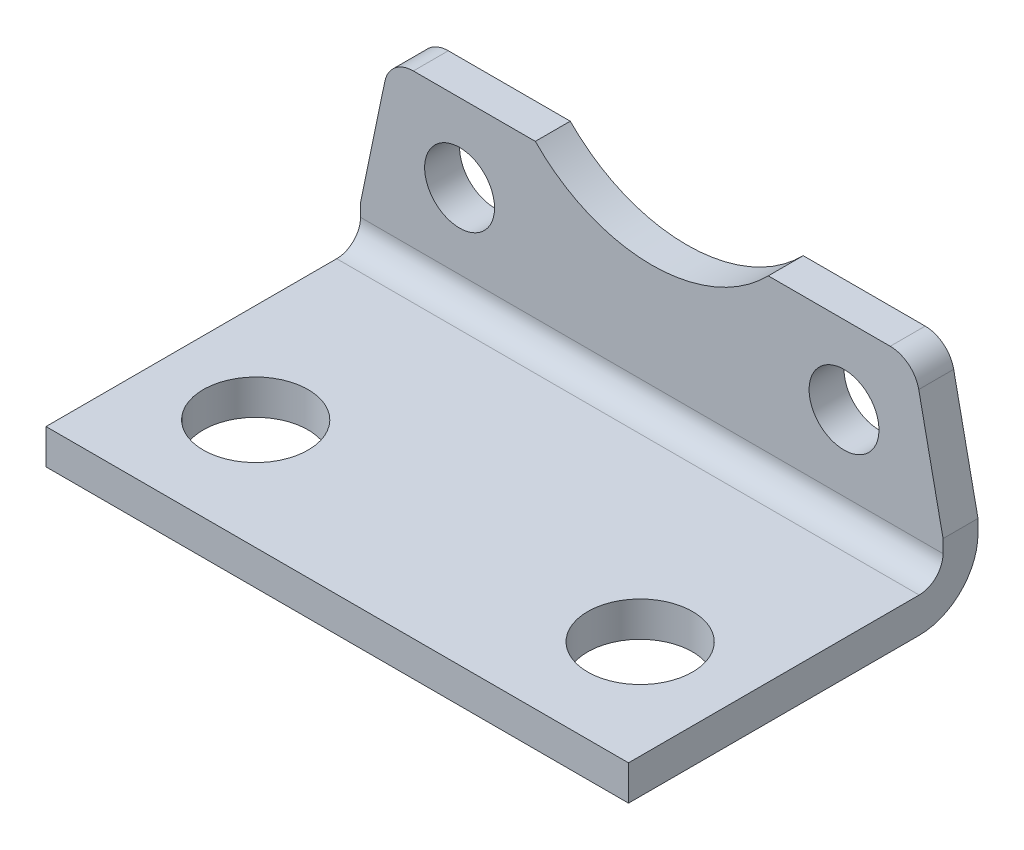
ISO-10303-21;
HEADER;
FILE_DESCRIPTION(('STEP AP214'),'2;1');
FILE_NAME('part.step','',(''),(''),'','','');
FILE_SCHEMA(('AUTOMOTIVE_DESIGN { 1 0 10303 214 1 1 1 1 }'));
ENDSEC;
DATA;
#1=APPLICATION_CONTEXT('core data for automotive mechanical design processes');
#2=APPLICATION_PROTOCOL_DEFINITION('international standard','automotive_design',2000,#1);
#3=PRODUCT_CONTEXT('',#1,'mechanical');
#4=PRODUCT('Part','Part','',(#3));
#5=PRODUCT_RELATED_PRODUCT_CATEGORY('part','',(#4));
#6=PRODUCT_DEFINITION_FORMATION('','',#4);
#7=PRODUCT_DEFINITION_CONTEXT('part definition',#1,'design');
#8=PRODUCT_DEFINITION('design','',#6,#7);
#9=PRODUCT_DEFINITION_SHAPE('','',#8);
#10=(LENGTH_UNIT() NAMED_UNIT(*) SI_UNIT(.MILLI.,.METRE.));
#11=(NAMED_UNIT(*) PLANE_ANGLE_UNIT() SI_UNIT($,.RADIAN.));
#12=(NAMED_UNIT(*) SI_UNIT($,.STERADIAN.) SOLID_ANGLE_UNIT());
#13=UNCERTAINTY_MEASURE_WITH_UNIT(LENGTH_MEASURE(1.E-05),#10,'distance_accuracy_value','');
#14=(GEOMETRIC_REPRESENTATION_CONTEXT(3) GLOBAL_UNCERTAINTY_ASSIGNED_CONTEXT((#13)) GLOBAL_UNIT_ASSIGNED_CONTEXT((#10,
#11,#12)) REPRESENTATION_CONTEXT('',''));
#15=CARTESIAN_POINT('',(0.,0.,0.));
#16=DIRECTION('',(0.,0.,1.));
#17=DIRECTION('',(1.,0.,0.));
#18=AXIS2_PLACEMENT_3D('',#15,#16,#17);
#19=CARTESIAN_POINT('',(-25.,5.05,49.5));
#20=DIRECTION('',(0.,0.,1.));
#21=DIRECTION('',(1.,0.,0.));
#22=AXIS2_PLACEMENT_3D('',#19,#20,#21);
#23=PLANE('',#22);
#24=DIRECTION('',(0.203466721205623,-0.979081862441458,0.));
#25=VECTOR('',#24,1.);
#26=CARTESIAN_POINT('',(22.5,18.2,49.5));
#27=LINE('',#26,#25);
#28=CARTESIAN_POINT('',(22.9138265164144,16.2086668030141,49.5));
#29=VERTEX_POINT('',#28);
#30=CARTESIAN_POINT('',(25.,6.17,49.5));
#31=VERTEX_POINT('',#30);
#32=EDGE_CURVE('E150',#29,#31,#27,.T.);
#33=ORIENTED_EDGE('',*,*,#32,.F.);
#34=CARTESIAN_POINT('',(20.4661218603107,15.7,49.5));
#35=DIRECTION('',(0.,0.,1.));
#36=DIRECTION('',(1.,0.,0.));
#37=AXIS2_PLACEMENT_3D('',#34,#35,#36);
#38=CIRCLE('',#37,2.5);
#39=CARTESIAN_POINT('',(20.4661218603107,18.2,49.5));
#40=VERTEX_POINT('',#39);
#41=EDGE_CURVE('E200',#29,#40,#38,.T.);
#42=ORIENTED_EDGE('',*,*,#41,.T.);
#43=DIRECTION('',(1.,0.,0.));
#44=VECTOR('',#43,1.);
#45=CARTESIAN_POINT('',(-25.,18.2,49.5));
#46=LINE('',#45,#44);
#47=CARTESIAN_POINT('',(9.99799979995999,18.2,49.5));
#48=VERTEX_POINT('',#47);
#49=EDGE_CURVE('E222',#48,#40,#46,.T.);
#50=ORIENTED_EDGE('',*,*,#49,.F.);
#51=CARTESIAN_POINT('',(0.,28.,49.5));
#52=DIRECTION('',(0.,0.,1.));
#53=DIRECTION('',(1.,0.,0.));
#54=AXIS2_PLACEMENT_3D('',#51,#52,#53);
#55=CIRCLE('',#54,14.);
#56=CARTESIAN_POINT('',(-9.99799979995999,18.2,49.5));
#57=VERTEX_POINT('',#56);
#58=EDGE_CURVE('E220',#57,#48,#55,.T.);
#59=ORIENTED_EDGE('',*,*,#58,.F.);
#60=CARTESIAN_POINT('',(-20.4661218603107,18.2,49.5));
#61=VERTEX_POINT('',#60);
#62=EDGE_CURVE('E211',#61,#57,#46,.T.);
#63=ORIENTED_EDGE('',*,*,#62,.F.);
#64=CARTESIAN_POINT('',(-20.4661218603107,15.7,49.5));
#65=DIRECTION('',(0.,0.,1.));
#66=DIRECTION('',(1.,0.,0.));
#67=AXIS2_PLACEMENT_3D('',#64,#65,#66);
#68=CIRCLE('',#67,2.5);
#69=CARTESIAN_POINT('',(-22.9138265164144,16.2086668030141,49.5));
#70=VERTEX_POINT('',#69);
#71=EDGE_CURVE('E198',#61,#70,#68,.T.);
#72=ORIENTED_EDGE('',*,*,#71,.T.);
#73=DIRECTION('',(0.203466721205623,0.979081862441458,0.));
#74=VECTOR('',#73,1.);
#75=CARTESIAN_POINT('',(-22.5,18.2,49.5));
#76=LINE('',#75,#74);
#77=CARTESIAN_POINT('',(-25.,6.17,49.5));
#78=VERTEX_POINT('',#77);
#79=EDGE_CURVE('E290',#78,#70,#76,.T.);
#80=ORIENTED_EDGE('',*,*,#79,.F.);
#81=DIRECTION('',(0.,-1.,0.));
#82=VECTOR('',#81,1.);
#83=CARTESIAN_POINT('',(-25.,5.05,49.5));
#84=LINE('',#83,#82);
#85=CARTESIAN_POINT('',(-25.,5.05,49.5));
#86=VERTEX_POINT('',#85);
#87=EDGE_CURVE('E263',#78,#86,#84,.T.);
#88=ORIENTED_EDGE('',*,*,#87,.T.);
#89=DIRECTION('',(1.,0.,0.));
#90=VECTOR('',#89,1.);
#91=CARTESIAN_POINT('',(-25.,5.05,49.5));
#92=LINE('',#91,#90);
#93=CARTESIAN_POINT('',(25.,5.05,49.5));
#94=VERTEX_POINT('',#93);
#95=EDGE_CURVE('E183',#86,#94,#92,.T.);
#96=ORIENTED_EDGE('',*,*,#95,.T.);
#97=DIRECTION('',(0.,-1.,0.));
#98=VECTOR('',#97,1.);
#99=CARTESIAN_POINT('',(25.,5.05,49.5));
#100=LINE('',#99,#98);
#101=EDGE_CURVE('E159',#31,#94,#100,.T.);
#102=ORIENTED_EDGE('',*,*,#101,.F.);
#103=EDGE_LOOP('',(#33,#42,#50,#59,#63,#72,#80,#88,#96,#102));
#104=FACE_BOUND('',#103,.T.);
#105=CARTESIAN_POINT('',(-16.5,11.5,49.5));
#106=DIRECTION('',(0.,0.,1.));
#107=DIRECTION('',(1.,0.,0.));
#108=AXIS2_PLACEMENT_3D('',#105,#106,#107);
#109=CIRCLE('',#108,3.);
#110=CARTESIAN_POINT('',(-13.5,11.5,49.5));
#111=VERTEX_POINT('',#110);
#112=EDGE_CURVE('E235',#111,#111,#109,.T.);
#113=ORIENTED_EDGE('',*,*,#112,.F.);
#114=EDGE_LOOP('',(#113));
#115=FACE_BOUND('',#114,.T.);
#116=CARTESIAN_POINT('',(16.5,11.5,49.5));
#117=DIRECTION('',(0.,0.,-1.));
#118=DIRECTION('',(-1.,0.,0.));
#119=AXIS2_PLACEMENT_3D('',#116,#117,#118);
#120=CIRCLE('',#119,3.);
#121=CARTESIAN_POINT('',(13.5,11.5,49.5));
#122=VERTEX_POINT('',#121);
#123=EDGE_CURVE('E230',#122,#122,#120,.T.);
#124=ORIENTED_EDGE('',*,*,#123,.T.);
#125=EDGE_LOOP('',(#124));
#126=FACE_BOUND('',#125,.T.);
#127=ADVANCED_FACE('F32',(#104,#115,#126),#23,.T.);
#128=CARTESIAN_POINT('',(-25.,5.05,46.5));
#129=DIRECTION('',(0.,0.,-1.));
#130=DIRECTION('',(0.,1.,0.));
#131=AXIS2_PLACEMENT_3D('',#128,#129,#130);
#132=PLANE('',#131);
#133=DIRECTION('',(1.,0.,0.));
#134=VECTOR('',#133,1.);
#135=CARTESIAN_POINT('',(-25.,18.2,46.5));
#136=LINE('',#135,#134);
#137=CARTESIAN_POINT('',(9.99799979995999,18.2,46.5));
#138=VERTEX_POINT('',#137);
#139=CARTESIAN_POINT('',(20.4661218603107,18.2,46.5));
#140=VERTEX_POINT('',#139);
#141=EDGE_CURVE('E221',#138,#140,#136,.T.);
#142=ORIENTED_EDGE('',*,*,#141,.T.);
#143=CARTESIAN_POINT('',(20.4661218603107,15.7,46.5));
#144=DIRECTION('',(0.,0.,-1.));
#145=DIRECTION('',(0.,1.,0.));
#146=AXIS2_PLACEMENT_3D('',#143,#144,#145);
#147=CIRCLE('',#146,2.5);
#148=CARTESIAN_POINT('',(22.9138265164144,16.2086668030141,46.5));
#149=VERTEX_POINT('',#148);
#150=EDGE_CURVE('E140',#140,#149,#147,.T.);
#151=ORIENTED_EDGE('',*,*,#150,.T.);
#152=DIRECTION('',(0.203466721205623,-0.979081862441458,0.));
#153=VECTOR('',#152,1.);
#154=CARTESIAN_POINT('',(22.5,18.2,46.5));
#155=LINE('',#154,#153);
#156=CARTESIAN_POINT('',(25.,6.17,46.5));
#157=VERTEX_POINT('',#156);
#158=EDGE_CURVE('E131',#149,#157,#155,.T.);
#159=ORIENTED_EDGE('',*,*,#158,.T.);
#160=DIRECTION('',(0.,1.,0.));
#161=VECTOR('',#160,1.);
#162=CARTESIAN_POINT('',(25.,5.05,46.5));
#163=LINE('',#162,#161);
#164=CARTESIAN_POINT('',(25.,5.05,46.5));
#165=VERTEX_POINT('',#164);
#166=EDGE_CURVE('E137',#165,#157,#163,.T.);
#167=ORIENTED_EDGE('',*,*,#166,.F.);
#168=DIRECTION('',(1.,0.,0.));
#169=VECTOR('',#168,1.);
#170=CARTESIAN_POINT('',(-25.,5.05,46.5));
#171=LINE('',#170,#169);
#172=CARTESIAN_POINT('',(-25.,5.05,46.5));
#173=VERTEX_POINT('',#172);
#174=EDGE_CURVE('E186',#173,#165,#171,.T.);
#175=ORIENTED_EDGE('',*,*,#174,.F.);
#176=DIRECTION('',(0.,1.,0.));
#177=VECTOR('',#176,1.);
#178=CARTESIAN_POINT('',(-25.,5.05,46.5));
#179=LINE('',#178,#177);
#180=CARTESIAN_POINT('',(-25.,6.17,46.5));
#181=VERTEX_POINT('',#180);
#182=EDGE_CURVE('E260',#173,#181,#179,.T.);
#183=ORIENTED_EDGE('',*,*,#182,.T.);
#184=DIRECTION('',(0.203466721205623,0.979081862441458,0.));
#185=VECTOR('',#184,1.);
#186=CARTESIAN_POINT('',(-22.5,18.2,46.5));
#187=LINE('',#186,#185);
#188=CARTESIAN_POINT('',(-22.9138265164144,16.2086668030141,46.5));
#189=VERTEX_POINT('',#188);
#190=EDGE_CURVE('E145',#181,#189,#187,.T.);
#191=ORIENTED_EDGE('',*,*,#190,.T.);
#192=CARTESIAN_POINT('',(-20.4661218603107,15.7,46.5));
#193=DIRECTION('',(0.,0.,-1.));
#194=DIRECTION('',(0.,1.,0.));
#195=AXIS2_PLACEMENT_3D('',#192,#193,#194);
#196=CIRCLE('',#195,2.5);
#197=CARTESIAN_POINT('',(-20.4661218603107,18.2,46.5));
#198=VERTEX_POINT('',#197);
#199=EDGE_CURVE('E47',#189,#198,#196,.T.);
#200=ORIENTED_EDGE('',*,*,#199,.T.);
#201=CARTESIAN_POINT('',(-9.99799979995999,18.2,46.5));
#202=VERTEX_POINT('',#201);
#203=EDGE_CURVE('E212',#198,#202,#136,.T.);
#204=ORIENTED_EDGE('',*,*,#203,.T.);
#205=CARTESIAN_POINT('',(0.,28.,46.5));
#206=DIRECTION('',(0.,0.,1.));
#207=DIRECTION('',(1.,0.,0.));
#208=AXIS2_PLACEMENT_3D('',#205,#206,#207);
#209=CIRCLE('',#208,14.);
#210=EDGE_CURVE('E227',#202,#138,#209,.T.);
#211=ORIENTED_EDGE('',*,*,#210,.T.);
#212=EDGE_LOOP('',(#142,#151,#159,#167,#175,#183,#191,#200,#204,#211));
#213=FACE_BOUND('',#212,.T.);
#214=CARTESIAN_POINT('',(-16.5,11.5,46.5));
#215=DIRECTION('',(0.,0.,1.));
#216=DIRECTION('',(1.,0.,0.));
#217=AXIS2_PLACEMENT_3D('',#214,#215,#216);
#218=CIRCLE('',#217,3.);
#219=CARTESIAN_POINT('',(-13.5,11.5,46.5));
#220=VERTEX_POINT('',#219);
#221=EDGE_CURVE('E238',#220,#220,#218,.T.);
#222=ORIENTED_EDGE('',*,*,#221,.T.);
#223=EDGE_LOOP('',(#222));
#224=FACE_BOUND('',#223,.T.);
#225=CARTESIAN_POINT('',(16.5,11.5,46.5));
#226=DIRECTION('',(0.,0.,-1.));
#227=DIRECTION('',(-1.,0.,0.));
#228=AXIS2_PLACEMENT_3D('',#225,#226,#227);
#229=CIRCLE('',#228,3.);
#230=CARTESIAN_POINT('',(13.5,11.5,46.5));
#231=VERTEX_POINT('',#230);
#232=EDGE_CURVE('E232',#231,#231,#229,.T.);
#233=ORIENTED_EDGE('',*,*,#232,.F.);
#234=EDGE_LOOP('',(#233));
#235=FACE_BOUND('',#234,.T.);
#236=ADVANCED_FACE('F134',(#213,#224,#235),#132,.T.);
#237=CARTESIAN_POINT('',(-25.,0.,76.5));
#238=DIRECTION('',(0.,-1.,0.));
#239=DIRECTION('',(0.,0.,-1.));
#240=AXIS2_PLACEMENT_3D('',#237,#238,#239);
#241=PLANE('',#240);
#242=DIRECTION('',(0.,0.,-1.));
#243=VECTOR('',#242,1.);
#244=CARTESIAN_POINT('',(25.,0.,76.5));
#245=LINE('',#244,#243);
#246=CARTESIAN_POINT('',(25.,0.,76.5));
#247=VERTEX_POINT('',#246);
#248=CARTESIAN_POINT('',(25.,0.,51.55));
#249=VERTEX_POINT('',#248);
#250=EDGE_CURVE('E163',#247,#249,#245,.T.);
#251=ORIENTED_EDGE('',*,*,#250,.F.);
#252=DIRECTION('',(1.,0.,0.));
#253=VECTOR('',#252,1.);
#254=CARTESIAN_POINT('',(-25.,0.,76.5));
#255=LINE('',#254,#253);
#256=CARTESIAN_POINT('',(-25.,0.,76.5));
#257=VERTEX_POINT('',#256);
#258=EDGE_CURVE('E176',#257,#247,#255,.T.);
#259=ORIENTED_EDGE('',*,*,#258,.F.);
#260=DIRECTION('',(0.,0.,-1.));
#261=VECTOR('',#260,1.);
#262=CARTESIAN_POINT('',(-25.,0.,76.5));
#263=LINE('',#262,#261);
#264=CARTESIAN_POINT('',(-25.,0.,51.55));
#265=VERTEX_POINT('',#264);
#266=EDGE_CURVE('E175',#257,#265,#263,.T.);
#267=ORIENTED_EDGE('',*,*,#266,.T.);
#268=DIRECTION('',(1.,0.,0.));
#269=VECTOR('',#268,1.);
#270=CARTESIAN_POINT('',(-25.,0.,51.55));
#271=LINE('',#270,#269);
#272=EDGE_CURVE('E188',#265,#249,#271,.T.);
#273=ORIENTED_EDGE('',*,*,#272,.T.);
#274=EDGE_LOOP('',(#251,#259,#267,#273));
#275=FACE_BOUND('',#274,.T.);
#276=CARTESIAN_POINT('',(-16.5,0.,67.));
#277=DIRECTION('',(0.,1.,0.));
#278=DIRECTION('',(0.,0.,1.));
#279=AXIS2_PLACEMENT_3D('',#276,#277,#278);
#280=CIRCLE('',#279,4.50000000000001);
#281=CARTESIAN_POINT('',(-16.5,0.,71.5));
#282=VERTEX_POINT('',#281);
#283=EDGE_CURVE('E250',#282,#282,#280,.T.);
#284=ORIENTED_EDGE('',*,*,#283,.T.);
#285=EDGE_LOOP('',(#284));
#286=FACE_BOUND('',#285,.T.);
#287=CARTESIAN_POINT('',(16.5,0.,67.));
#288=DIRECTION('',(0.,-1.,0.));
#289=DIRECTION('',(0.,0.,1.));
#290=AXIS2_PLACEMENT_3D('',#287,#288,#289);
#291=CIRCLE('',#290,4.50000000000001);
#292=CARTESIAN_POINT('',(16.5,0.,71.5));
#293=VERTEX_POINT('',#292);
#294=EDGE_CURVE('E244',#293,#293,#291,.T.);
#295=ORIENTED_EDGE('',*,*,#294,.F.);
#296=EDGE_LOOP('',(#295));
#297=FACE_BOUND('',#296,.T.);
#298=ADVANCED_FACE('F275',(#275,#286,#297),#241,.T.);
#299=CARTESIAN_POINT('',(-25.,3.,76.5));
#300=DIRECTION('',(0.,1.,0.));
#301=DIRECTION('',(0.,0.,1.));
#302=AXIS2_PLACEMENT_3D('',#299,#300,#301);
#303=PLANE('',#302);
#304=DIRECTION('',(0.,0.,1.));
#305=VECTOR('',#304,1.);
#306=CARTESIAN_POINT('',(25.,3.,76.5));
#307=LINE('',#306,#305);
#308=CARTESIAN_POINT('',(25.,3.,51.55));
#309=VERTEX_POINT('',#308);
#310=CARTESIAN_POINT('',(25.,3.,76.5));
#311=VERTEX_POINT('',#310);
#312=EDGE_CURVE('E169',#309,#311,#307,.T.);
#313=ORIENTED_EDGE('',*,*,#312,.F.);
#314=DIRECTION('',(1.,0.,0.));
#315=VECTOR('',#314,1.);
#316=CARTESIAN_POINT('',(-25.,3.,51.55));
#317=LINE('',#316,#315);
#318=CARTESIAN_POINT('',(-25.,3.,51.55));
#319=VERTEX_POINT('',#318);
#320=EDGE_CURVE('E181',#319,#309,#317,.T.);
#321=ORIENTED_EDGE('',*,*,#320,.F.);
#322=DIRECTION('',(0.,0.,1.));
#323=VECTOR('',#322,1.);
#324=CARTESIAN_POINT('',(-25.,3.,76.5));
#325=LINE('',#324,#323);
#326=CARTESIAN_POINT('',(-25.,3.,76.5));
#327=VERTEX_POINT('',#326);
#328=EDGE_CURVE('E268',#319,#327,#325,.T.);
#329=ORIENTED_EDGE('',*,*,#328,.T.);
#330=DIRECTION('',(1.,0.,0.));
#331=VECTOR('',#330,1.);
#332=CARTESIAN_POINT('',(-25.,3.,76.5));
#333=LINE('',#332,#331);
#334=EDGE_CURVE('E179',#327,#311,#333,.T.);
#335=ORIENTED_EDGE('',*,*,#334,.T.);
#336=EDGE_LOOP('',(#313,#321,#329,#335));
#337=FACE_BOUND('',#336,.T.);
#338=CARTESIAN_POINT('',(-16.5,3.,67.));
#339=DIRECTION('',(0.,1.,0.));
#340=DIRECTION('',(0.,0.,1.));
#341=AXIS2_PLACEMENT_3D('',#338,#339,#340);
#342=CIRCLE('',#341,4.50000000000001);
#343=CARTESIAN_POINT('',(-16.5,3.,71.5));
#344=VERTEX_POINT('',#343);
#345=EDGE_CURVE('E247',#344,#344,#342,.T.);
#346=ORIENTED_EDGE('',*,*,#345,.F.);
#347=EDGE_LOOP('',(#346));
#348=FACE_BOUND('',#347,.T.);
#349=CARTESIAN_POINT('',(16.5,3.,67.));
#350=DIRECTION('',(0.,-1.,0.));
#351=DIRECTION('',(0.,0.,1.));
#352=AXIS2_PLACEMENT_3D('',#349,#350,#351);
#353=CIRCLE('',#352,4.50000000000001);
#354=CARTESIAN_POINT('',(16.5,3.,71.5));
#355=VERTEX_POINT('',#354);
#356=EDGE_CURVE('E241',#355,#355,#353,.T.);
#357=ORIENTED_EDGE('',*,*,#356,.T.);
#358=EDGE_LOOP('',(#357));
#359=FACE_BOUND('',#358,.T.);
#360=ADVANCED_FACE('F312',(#337,#348,#359),#303,.T.);
#361=CARTESIAN_POINT('',(-25.,0.,76.5));
#362=DIRECTION('',(0.,0.,1.));
#363=DIRECTION('',(1.,0.,0.));
#364=AXIS2_PLACEMENT_3D('',#361,#362,#363);
#365=PLANE('',#364);
#366=DIRECTION('',(0.,-1.,0.));
#367=VECTOR('',#366,1.);
#368=CARTESIAN_POINT('',(25.,0.,76.5));
#369=LINE('',#368,#367);
#370=EDGE_CURVE('E172',#311,#247,#369,.T.);
#371=ORIENTED_EDGE('',*,*,#370,.F.);
#372=ORIENTED_EDGE('',*,*,#334,.F.);
#373=DIRECTION('',(0.,-1.,0.));
#374=VECTOR('',#373,1.);
#375=CARTESIAN_POINT('',(-25.,0.,76.5));
#376=LINE('',#375,#374);
#377=EDGE_CURVE('E190',#327,#257,#376,.T.);
#378=ORIENTED_EDGE('',*,*,#377,.T.);
#379=ORIENTED_EDGE('',*,*,#258,.T.);
#380=EDGE_LOOP('',(#371,#372,#378,#379));
#381=FACE_BOUND('',#380,.T.);
#382=ADVANCED_FACE('F316',(#381),#365,.T.);
#383=CARTESIAN_POINT('',(-25.,5.05,51.55));
#384=DIRECTION('',(1.,0.,0.));
#385=DIRECTION('',(0.,0.,-1.));
#386=AXIS2_PLACEMENT_3D('',#383,#384,#385);
#387=CYLINDRICAL_SURFACE('',#386,2.05);
#388=CARTESIAN_POINT('',(25.,5.05,51.55));
#389=DIRECTION('',(-1.,0.,0.));
#390=DIRECTION('',(0.,0.,-1.));
#391=AXIS2_PLACEMENT_3D('',#388,#389,#390);
#392=CIRCLE('',#391,2.05);
#393=EDGE_CURVE('E161',#94,#309,#392,.T.);
#394=ORIENTED_EDGE('',*,*,#393,.F.);
#395=ORIENTED_EDGE('',*,*,#95,.F.);
#396=CARTESIAN_POINT('',(-25.,5.05,51.55));
#397=DIRECTION('',(-1.,0.,0.));
#398=DIRECTION('',(0.,0.,-1.));
#399=AXIS2_PLACEMENT_3D('',#396,#397,#398);
#400=CIRCLE('',#399,2.05);
#401=EDGE_CURVE('E265',#86,#319,#400,.T.);
#402=ORIENTED_EDGE('',*,*,#401,.T.);
#403=ORIENTED_EDGE('',*,*,#320,.T.);
#404=EDGE_LOOP('',(#394,#395,#402,#403));
#405=FACE_BOUND('',#404,.T.);
#406=ADVANCED_FACE('F306',(#405),#387,.F.);
#407=CARTESIAN_POINT('',(-25.,5.05,51.55));
#408=DIRECTION('',(1.,0.,0.));
#409=DIRECTION('',(0.,0.,-1.));
#410=AXIS2_PLACEMENT_3D('',#407,#408,#409);
#411=CYLINDRICAL_SURFACE('',#410,5.05000000000001);
#412=CARTESIAN_POINT('',(25.,5.05,51.55));
#413=DIRECTION('',(1.,0.,0.));
#414=DIRECTION('',(0.,0.,-1.));
#415=AXIS2_PLACEMENT_3D('',#412,#413,#414);
#416=CIRCLE('',#415,5.05000000000001);
#417=EDGE_CURVE('E158',#249,#165,#416,.T.);
#418=ORIENTED_EDGE('',*,*,#417,.F.);
#419=ORIENTED_EDGE('',*,*,#272,.F.);
#420=CARTESIAN_POINT('',(-25.,5.05,51.55));
#421=DIRECTION('',(1.,0.,0.));
#422=DIRECTION('',(0.,0.,-1.));
#423=AXIS2_PLACEMENT_3D('',#420,#421,#422);
#424=CIRCLE('',#423,5.05000000000001);
#425=EDGE_CURVE('E257',#265,#173,#424,.T.);
#426=ORIENTED_EDGE('',*,*,#425,.T.);
#427=ORIENTED_EDGE('',*,*,#174,.T.);
#428=EDGE_LOOP('',(#418,#419,#426,#427));
#429=FACE_BOUND('',#428,.T.);
#430=ADVANCED_FACE('F280',(#429),#411,.T.);
#431=CARTESIAN_POINT('',(-25.,5.05,51.55));
#432=DIRECTION('',(1.,0.,0.));
#433=DIRECTION('',(0.,0.,-1.));
#434=AXIS2_PLACEMENT_3D('',#431,#432,#433);
#435=PLANE('',#434);
#436=ORIENTED_EDGE('',*,*,#87,.F.);
#437=DIRECTION('',(0.,0.,1.));
#438=VECTOR('',#437,1.);
#439=CARTESIAN_POINT('',(-25.,6.17,46.5));
#440=LINE('',#439,#438);
#441=EDGE_CURVE('E153',#181,#78,#440,.T.);
#442=ORIENTED_EDGE('',*,*,#441,.F.);
#443=ORIENTED_EDGE('',*,*,#182,.F.);
#444=ORIENTED_EDGE('',*,*,#425,.F.);
#445=ORIENTED_EDGE('',*,*,#266,.F.);
#446=ORIENTED_EDGE('',*,*,#377,.F.);
#447=ORIENTED_EDGE('',*,*,#328,.F.);
#448=ORIENTED_EDGE('',*,*,#401,.F.);
#449=EDGE_LOOP('',(#436,#442,#443,#444,#445,#446,#447,#448));
#450=FACE_BOUND('',#449,.T.);
#451=ADVANCED_FACE('F285',(#450),#435,.F.);
#452=CARTESIAN_POINT('',(25.,5.05,51.55));
#453=DIRECTION('',(1.,0.,0.));
#454=DIRECTION('',(0.,0.,-1.));
#455=AXIS2_PLACEMENT_3D('',#452,#453,#454);
#456=PLANE('',#455);
#457=DIRECTION('',(0.,0.,1.));
#458=VECTOR('',#457,1.);
#459=CARTESIAN_POINT('',(25.,6.17,46.5));
#460=LINE('',#459,#458);
#461=EDGE_CURVE('E144',#157,#31,#460,.T.);
#462=ORIENTED_EDGE('',*,*,#461,.T.);
#463=ORIENTED_EDGE('',*,*,#101,.T.);
#464=ORIENTED_EDGE('',*,*,#393,.T.);
#465=ORIENTED_EDGE('',*,*,#312,.T.);
#466=ORIENTED_EDGE('',*,*,#370,.T.);
#467=ORIENTED_EDGE('',*,*,#250,.T.);
#468=ORIENTED_EDGE('',*,*,#417,.T.);
#469=ORIENTED_EDGE('',*,*,#166,.T.);
#470=EDGE_LOOP('',(#462,#463,#464,#465,#466,#467,#468,#469));
#471=FACE_BOUND('',#470,.T.);
#472=ADVANCED_FACE('F155',(#471),#456,.T.);
#473=CARTESIAN_POINT('',(-16.5,0.,67.));
#474=DIRECTION('',(0.,1.,0.));
#475=DIRECTION('',(0.,0.,1.));
#476=AXIS2_PLACEMENT_3D('',#473,#474,#475);
#477=CYLINDRICAL_SURFACE('',#476,4.50000000000001);
#478=ORIENTED_EDGE('',*,*,#283,.F.);
#479=EDGE_LOOP('',(#478));
#480=FACE_BOUND('',#479,.T.);
#481=ORIENTED_EDGE('',*,*,#345,.T.);
#482=EDGE_LOOP('',(#481));
#483=FACE_BOUND('',#482,.T.);
#484=ADVANCED_FACE('F328',(#480,#483),#477,.F.);
#485=CARTESIAN_POINT('',(16.5,0.,67.));
#486=DIRECTION('',(0.,1.,0.));
#487=DIRECTION('',(0.,0.,1.));
#488=AXIS2_PLACEMENT_3D('',#485,#486,#487);
#489=CYLINDRICAL_SURFACE('',#488,4.50000000000001);
#490=ORIENTED_EDGE('',*,*,#294,.T.);
#491=EDGE_LOOP('',(#490));
#492=FACE_BOUND('',#491,.T.);
#493=ORIENTED_EDGE('',*,*,#356,.F.);
#494=EDGE_LOOP('',(#493));
#495=FACE_BOUND('',#494,.T.);
#496=ADVANCED_FACE('F333',(#492,#495),#489,.F.);
#497=CARTESIAN_POINT('',(-16.5,11.5,46.5));
#498=DIRECTION('',(0.,0.,1.));
#499=DIRECTION('',(1.,0.,0.));
#500=AXIS2_PLACEMENT_3D('',#497,#498,#499);
#501=CYLINDRICAL_SURFACE('',#500,3.);
#502=ORIENTED_EDGE('',*,*,#221,.F.);
#503=EDGE_LOOP('',(#502));
#504=FACE_BOUND('',#503,.T.);
#505=ORIENTED_EDGE('',*,*,#112,.T.);
#506=EDGE_LOOP('',(#505));
#507=FACE_BOUND('',#506,.T.);
#508=ADVANCED_FACE('F337',(#504,#507),#501,.F.);
#509=CARTESIAN_POINT('',(16.5,11.5,46.5));
#510=DIRECTION('',(0.,0.,1.));
#511=DIRECTION('',(1.,0.,0.));
#512=AXIS2_PLACEMENT_3D('',#509,#510,#511);
#513=CYLINDRICAL_SURFACE('',#512,3.);
#514=ORIENTED_EDGE('',*,*,#232,.T.);
#515=EDGE_LOOP('',(#514));
#516=FACE_BOUND('',#515,.T.);
#517=ORIENTED_EDGE('',*,*,#123,.F.);
#518=EDGE_LOOP('',(#517));
#519=FACE_BOUND('',#518,.T.);
#520=ADVANCED_FACE('F341',(#516,#519),#513,.F.);
#521=CARTESIAN_POINT('',(0.,28.,46.5));
#522=DIRECTION('',(0.,0.,1.));
#523=DIRECTION('',(1.,0.,0.));
#524=AXIS2_PLACEMENT_3D('',#521,#522,#523);
#525=CYLINDRICAL_SURFACE('',#524,14.);
#526=ORIENTED_EDGE('',*,*,#58,.T.);
#527=DIRECTION('',(0.,0.,1.));
#528=VECTOR('',#527,1.);
#529=CARTESIAN_POINT('',(9.99799979995999,18.2,46.5));
#530=LINE('',#529,#528);
#531=EDGE_CURVE('E193',#48,#138,#530,.F.);
#532=ORIENTED_EDGE('',*,*,#531,.T.);
#533=ORIENTED_EDGE('',*,*,#210,.F.);
#534=DIRECTION('',(0.,0.,1.));
#535=VECTOR('',#534,1.);
#536=CARTESIAN_POINT('',(-9.99799979995999,18.2,46.5));
#537=LINE('',#536,#535);
#538=EDGE_CURVE('E178',#202,#57,#537,.T.);
#539=ORIENTED_EDGE('',*,*,#538,.T.);
#540=EDGE_LOOP('',(#526,#532,#533,#539));
#541=FACE_BOUND('',#540,.T.);
#542=ADVANCED_FACE('F345',(#541),#525,.F.);
#543=CARTESIAN_POINT('',(-25.,18.2,46.5));
#544=DIRECTION('',(0.,-1.,0.));
#545=DIRECTION('',(0.,0.,-1.));
#546=AXIS2_PLACEMENT_3D('',#543,#544,#545);
#547=PLANE('',#546);
#548=ORIENTED_EDGE('',*,*,#203,.F.);
#549=DIRECTION('',(0.,0.,1.));
#550=VECTOR('',#549,1.);
#551=CARTESIAN_POINT('',(-20.4661218603107,18.2,46.5));
#552=LINE('',#551,#550);
#553=EDGE_CURVE('E40',#198,#61,#552,.T.);
#554=ORIENTED_EDGE('',*,*,#553,.T.);
#555=ORIENTED_EDGE('',*,*,#62,.T.);
#556=ORIENTED_EDGE('',*,*,#538,.F.);
#557=EDGE_LOOP('',(#548,#554,#555,#556));
#558=FACE_BOUND('',#557,.T.);
#559=ADVANCED_FACE('F209',(#558),#547,.F.);
#560=ORIENTED_EDGE('',*,*,#49,.T.);
#561=DIRECTION('',(0.,0.,1.));
#562=VECTOR('',#561,1.);
#563=CARTESIAN_POINT('',(20.4661218603107,18.2,46.5));
#564=LINE('',#563,#562);
#565=EDGE_CURVE('E202',#40,#140,#564,.F.);
#566=ORIENTED_EDGE('',*,*,#565,.T.);
#567=ORIENTED_EDGE('',*,*,#141,.F.);
#568=ORIENTED_EDGE('',*,*,#531,.F.);
#569=EDGE_LOOP('',(#560,#566,#567,#568));
#570=FACE_BOUND('',#569,.T.);
#571=ADVANCED_FACE('F350',(#570),#547,.F.);
#572=CARTESIAN_POINT('',(22.5,18.2,46.5));
#573=DIRECTION('',(-0.979081862441458,-0.203466721205623,0.));
#574=DIRECTION('',(0.203466721205623,-0.979081862441458,0.));
#575=AXIS2_PLACEMENT_3D('',#572,#573,#574);
#576=PLANE('',#575);
#577=ORIENTED_EDGE('',*,*,#158,.F.);
#578=DIRECTION('',(0.,0.,1.));
#579=VECTOR('',#578,1.);
#580=CARTESIAN_POINT('',(22.9138265164144,16.2086668030141,46.5));
#581=LINE('',#580,#579);
#582=EDGE_CURVE('E196',#149,#29,#581,.T.);
#583=ORIENTED_EDGE('',*,*,#582,.T.);
#584=ORIENTED_EDGE('',*,*,#32,.T.);
#585=ORIENTED_EDGE('',*,*,#461,.F.);
#586=EDGE_LOOP('',(#577,#583,#584,#585));
#587=FACE_BOUND('',#586,.T.);
#588=ADVANCED_FACE('F148',(#587),#576,.F.);
#589=CARTESIAN_POINT('',(-22.5,18.2,46.5));
#590=DIRECTION('',(0.979081862441458,-0.203466721205623,0.));
#591=DIRECTION('',(0.203466721205623,0.979081862441458,0.));
#592=AXIS2_PLACEMENT_3D('',#589,#590,#591);
#593=PLANE('',#592);
#594=ORIENTED_EDGE('',*,*,#79,.T.);
#595=DIRECTION('',(0.,0.,1.));
#596=VECTOR('',#595,1.);
#597=CARTESIAN_POINT('',(-22.9138265164144,16.2086668030141,46.5));
#598=LINE('',#597,#596);
#599=EDGE_CURVE('E11',#70,#189,#598,.F.);
#600=ORIENTED_EDGE('',*,*,#599,.T.);
#601=ORIENTED_EDGE('',*,*,#190,.F.);
#602=ORIENTED_EDGE('',*,*,#441,.T.);
#603=EDGE_LOOP('',(#594,#600,#601,#602));
#604=FACE_BOUND('',#603,.T.);
#605=ADVANCED_FACE('F297',(#604),#593,.F.);
#606=CARTESIAN_POINT('',(20.4661218603107,15.7,46.5));
#607=DIRECTION('',(0.,0.,1.));
#608=DIRECTION('',(1.,0.,0.));
#609=AXIS2_PLACEMENT_3D('',#606,#607,#608);
#610=CYLINDRICAL_SURFACE('',#609,2.5);
#611=ORIENTED_EDGE('',*,*,#150,.F.);
#612=ORIENTED_EDGE('',*,*,#565,.F.);
#613=ORIENTED_EDGE('',*,*,#41,.F.);
#614=ORIENTED_EDGE('',*,*,#582,.F.);
#615=EDGE_LOOP('',(#611,#612,#613,#614));
#616=FACE_BOUND('',#615,.T.);
#617=ADVANCED_FACE('F293',(#616),#610,.T.);
#618=CARTESIAN_POINT('',(-20.4661218603107,15.7,46.5));
#619=DIRECTION('',(0.,0.,1.));
#620=DIRECTION('',(1.,0.,0.));
#621=AXIS2_PLACEMENT_3D('',#618,#619,#620);
#622=CYLINDRICAL_SURFACE('',#621,2.5);
#623=ORIENTED_EDGE('',*,*,#199,.F.);
#624=ORIENTED_EDGE('',*,*,#599,.F.);
#625=ORIENTED_EDGE('',*,*,#71,.F.);
#626=ORIENTED_EDGE('',*,*,#553,.F.);
#627=EDGE_LOOP('',(#623,#624,#625,#626));
#628=FACE_BOUND('',#627,.T.);
#629=ADVANCED_FACE('F34',(#628),#622,.T.);
#630=CLOSED_SHELL('',(#127,#236,#298,#360,#382,#406,#430,#451,#472,#484,#496,#508,#520,#542,
#559,#571,#588,#605,#617,#629));
#631=MANIFOLD_SOLID_BREP('B2',#630);
#632=ADVANCED_BREP_SHAPE_REPRESENTATION('',(#18,#631),#14);
#633=SHAPE_DEFINITION_REPRESENTATION(#9,#632);
ENDSEC;
END-ISO-10303-21;
